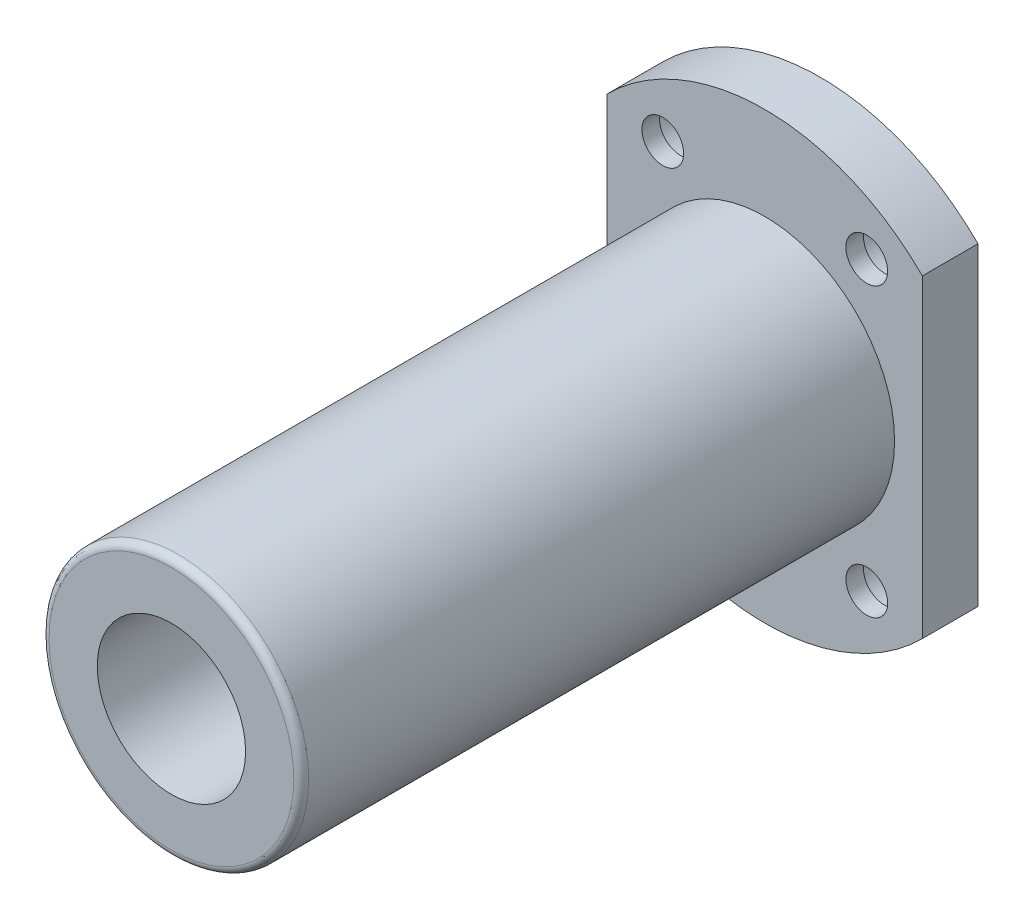
ISO-10303-21;
HEADER;
FILE_DESCRIPTION(('STEP AP214'),'2;1');
FILE_NAME('part.step','',(''),(''),'','','');
FILE_SCHEMA(('AUTOMOTIVE_DESIGN { 1 0 10303 214 1 1 1 1 }'));
ENDSEC;
DATA;
#1=APPLICATION_CONTEXT('core data for automotive mechanical design processes');
#2=APPLICATION_PROTOCOL_DEFINITION('international standard','automotive_design',2000,#1);
#3=PRODUCT_CONTEXT('',#1,'mechanical');
#4=PRODUCT('Part','Part','',(#3));
#5=PRODUCT_RELATED_PRODUCT_CATEGORY('part','',(#4));
#6=PRODUCT_DEFINITION_FORMATION('','',#4);
#7=PRODUCT_DEFINITION_CONTEXT('part definition',#1,'design');
#8=PRODUCT_DEFINITION('design','',#6,#7);
#9=PRODUCT_DEFINITION_SHAPE('','',#8);
#10=(LENGTH_UNIT() NAMED_UNIT(*) SI_UNIT(.MILLI.,.METRE.));
#11=(NAMED_UNIT(*) PLANE_ANGLE_UNIT() SI_UNIT($,.RADIAN.));
#12=(NAMED_UNIT(*) SI_UNIT($,.STERADIAN.) SOLID_ANGLE_UNIT());
#13=UNCERTAINTY_MEASURE_WITH_UNIT(LENGTH_MEASURE(1.E-05),#10,'distance_accuracy_value','');
#14=(GEOMETRIC_REPRESENTATION_CONTEXT(3) GLOBAL_UNCERTAINTY_ASSIGNED_CONTEXT((#13)) GLOBAL_UNIT_ASSIGNED_CONTEXT((#10,
#11,#12)) REPRESENTATION_CONTEXT('',''));
#15=CARTESIAN_POINT('',(0.,0.,0.));
#16=DIRECTION('',(0.,0.,1.));
#17=DIRECTION('',(1.,0.,0.));
#18=AXIS2_PLACEMENT_3D('',#15,#16,#17);
#19=CARTESIAN_POINT('',(11.,15.5,0.));
#20=DIRECTION('',(0.,0.,1.));
#21=DIRECTION('',(1.,0.,0.));
#22=AXIS2_PLACEMENT_3D('',#19,#20,#21);
#23=CYLINDRICAL_SURFACE('',#22,3.75);
#24=CARTESIAN_POINT('',(11.,15.5,4.1));
#25=DIRECTION('',(0.,0.,1.));
#26=DIRECTION('',(1.,0.,0.));
#27=AXIS2_PLACEMENT_3D('',#24,#25,#26);
#28=CIRCLE('',#27,3.75);
#29=CARTESIAN_POINT('',(14.75,15.5,4.1));
#30=VERTEX_POINT('',#29);
#31=EDGE_CURVE('E19',#30,#30,#28,.F.);
#32=ORIENTED_EDGE('',*,*,#31,.F.);
#33=EDGE_LOOP('',(#32));
#34=FACE_BOUND('',#33,.T.);
#35=CARTESIAN_POINT('',(11.,15.5,0.));
#36=DIRECTION('',(0.,0.,1.));
#37=DIRECTION('',(1.,0.,0.));
#38=AXIS2_PLACEMENT_3D('',#35,#36,#37);
#39=CIRCLE('',#38,3.75);
#40=CARTESIAN_POINT('',(14.75,15.5,0.));
#41=VERTEX_POINT('',#40);
#42=EDGE_CURVE('E204',#41,#41,#39,.T.);
#43=ORIENTED_EDGE('',*,*,#42,.F.);
#44=EDGE_LOOP('',(#43));
#45=FACE_BOUND('',#44,.T.);
#46=ADVANCED_FACE('F16',(#34,#45),#23,.F.);
#47=CARTESIAN_POINT('',(-11.,15.5,0.));
#48=DIRECTION('',(0.,0.,1.));
#49=DIRECTION('',(1.,0.,0.));
#50=AXIS2_PLACEMENT_3D('',#47,#48,#49);
#51=CYLINDRICAL_SURFACE('',#50,3.75);
#52=CARTESIAN_POINT('',(-11.,15.5,4.1));
#53=DIRECTION('',(0.,0.,1.));
#54=DIRECTION('',(1.,0.,0.));
#55=AXIS2_PLACEMENT_3D('',#52,#53,#54);
#56=CIRCLE('',#55,3.75);
#57=CARTESIAN_POINT('',(-7.25,15.5,4.1));
#58=VERTEX_POINT('',#57);
#59=EDGE_CURVE('E206',#58,#58,#56,.F.);
#60=ORIENTED_EDGE('',*,*,#59,.F.);
#61=EDGE_LOOP('',(#60));
#62=FACE_BOUND('',#61,.T.);
#63=CARTESIAN_POINT('',(-11.,15.5,0.));
#64=DIRECTION('',(0.,0.,1.));
#65=DIRECTION('',(1.,0.,0.));
#66=AXIS2_PLACEMENT_3D('',#63,#64,#65);
#67=CIRCLE('',#66,3.75);
#68=CARTESIAN_POINT('',(-7.25,15.5,0.));
#69=VERTEX_POINT('',#68);
#70=EDGE_CURVE('E201',#69,#69,#67,.T.);
#71=ORIENTED_EDGE('',*,*,#70,.F.);
#72=EDGE_LOOP('',(#71));
#73=FACE_BOUND('',#72,.T.);
#74=ADVANCED_FACE('F132',(#62,#73),#51,.F.);
#75=CARTESIAN_POINT('',(-11.,-15.5,6.));
#76=DIRECTION('',(0.,0.,-1.));
#77=DIRECTION('',(-1.,0.,0.));
#78=AXIS2_PLACEMENT_3D('',#75,#76,#77);
#79=CYLINDRICAL_SURFACE('',#78,3.75);
#80=CARTESIAN_POINT('',(-11.,-15.5,0.));
#81=DIRECTION('',(0.,0.,-1.));
#82=DIRECTION('',(-1.,0.,0.));
#83=AXIS2_PLACEMENT_3D('',#80,#81,#82);
#84=CIRCLE('',#83,3.75);
#85=CARTESIAN_POINT('',(-14.75,-15.5,0.));
#86=VERTEX_POINT('',#85);
#87=EDGE_CURVE('E195',#86,#86,#84,.F.);
#88=ORIENTED_EDGE('',*,*,#87,.F.);
#89=EDGE_LOOP('',(#88));
#90=FACE_BOUND('',#89,.T.);
#91=CARTESIAN_POINT('',(-11.,-15.5,4.1));
#92=DIRECTION('',(0.,0.,-1.));
#93=DIRECTION('',(-1.,0.,0.));
#94=AXIS2_PLACEMENT_3D('',#91,#92,#93);
#95=CIRCLE('',#94,3.75);
#96=CARTESIAN_POINT('',(-14.75,-15.5,4.1));
#97=VERTEX_POINT('',#96);
#98=EDGE_CURVE('E189',#97,#97,#95,.T.);
#99=ORIENTED_EDGE('',*,*,#98,.F.);
#100=EDGE_LOOP('',(#99));
#101=FACE_BOUND('',#100,.T.);
#102=ADVANCED_FACE('F129',(#90,#101),#79,.F.);
#103=CARTESIAN_POINT('',(11.,-15.5,6.));
#104=DIRECTION('',(0.,0.,-1.));
#105=DIRECTION('',(-1.,0.,0.));
#106=AXIS2_PLACEMENT_3D('',#103,#104,#105);
#107=CYLINDRICAL_SURFACE('',#106,3.75);
#108=CARTESIAN_POINT('',(11.,-15.5,0.));
#109=DIRECTION('',(0.,0.,-1.));
#110=DIRECTION('',(-1.,0.,0.));
#111=AXIS2_PLACEMENT_3D('',#108,#109,#110);
#112=CIRCLE('',#111,3.75);
#113=CARTESIAN_POINT('',(7.25,-15.5,0.));
#114=VERTEX_POINT('',#113);
#115=EDGE_CURVE('E192',#114,#114,#112,.F.);
#116=ORIENTED_EDGE('',*,*,#115,.F.);
#117=EDGE_LOOP('',(#116));
#118=FACE_BOUND('',#117,.T.);
#119=CARTESIAN_POINT('',(11.,-15.5,4.1));
#120=DIRECTION('',(0.,0.,-1.));
#121=DIRECTION('',(-1.,0.,0.));
#122=AXIS2_PLACEMENT_3D('',#119,#120,#121);
#123=CIRCLE('',#122,3.75);
#124=CARTESIAN_POINT('',(7.25,-15.5,4.1));
#125=VERTEX_POINT('',#124);
#126=EDGE_CURVE('E186',#125,#125,#123,.T.);
#127=ORIENTED_EDGE('',*,*,#126,.F.);
#128=EDGE_LOOP('',(#127));
#129=FACE_BOUND('',#128,.T.);
#130=ADVANCED_FACE('F125',(#118,#129),#107,.F.);
#131=CARTESIAN_POINT('',(0.,0.,0.));
#132=DIRECTION('',(0.,0.,1.));
#133=DIRECTION('',(1.,0.,0.));
#134=AXIS2_PLACEMENT_3D('',#131,#132,#133);
#135=CYLINDRICAL_SURFACE('',#134,8.);
#136=CARTESIAN_POINT('',(0.,0.,70.));
#137=DIRECTION('',(0.,0.,1.));
#138=DIRECTION('',(1.,0.,0.));
#139=AXIS2_PLACEMENT_3D('',#136,#137,#138);
#140=CIRCLE('',#139,8.);
#141=CARTESIAN_POINT('',(8.,0.,70.));
#142=VERTEX_POINT('',#141);
#143=EDGE_CURVE('E183',#142,#142,#140,.F.);
#144=ORIENTED_EDGE('',*,*,#143,.F.);
#145=EDGE_LOOP('',(#144));
#146=FACE_BOUND('',#145,.T.);
#147=CARTESIAN_POINT('',(0.,0.,0.));
#148=DIRECTION('',(0.,0.,1.));
#149=DIRECTION('',(1.,0.,0.));
#150=AXIS2_PLACEMENT_3D('',#147,#148,#149);
#151=CIRCLE('',#150,8.);
#152=CARTESIAN_POINT('',(8.,0.,0.));
#153=VERTEX_POINT('',#152);
#154=EDGE_CURVE('E198',#153,#153,#151,.T.);
#155=ORIENTED_EDGE('',*,*,#154,.F.);
#156=EDGE_LOOP('',(#155));
#157=FACE_BOUND('',#156,.T.);
#158=ADVANCED_FACE('F121',(#146,#157),#135,.F.);
#159=CARTESIAN_POINT('',(11.,17.75,4.1));
#160=DIRECTION('',(0.,0.,-1.));
#161=DIRECTION('',(-1.,0.,0.));
#162=AXIS2_PLACEMENT_3D('',#159,#160,#161);
#163=PLANE('',#162);
#164=CARTESIAN_POINT('',(11.,15.5,4.1));
#165=DIRECTION('',(0.,0.,1.));
#166=DIRECTION('',(1.,0.,0.));
#167=AXIS2_PLACEMENT_3D('',#164,#165,#166);
#168=CIRCLE('',#167,2.25);
#169=CARTESIAN_POINT('',(13.25,15.5,4.1));
#170=VERTEX_POINT('',#169);
#171=EDGE_CURVE('E180',#170,#170,#168,.T.);
#172=ORIENTED_EDGE('',*,*,#171,.T.);
#173=EDGE_LOOP('',(#172));
#174=FACE_BOUND('',#173,.T.);
#175=ORIENTED_EDGE('',*,*,#31,.T.);
#176=EDGE_LOOP('',(#175));
#177=FACE_BOUND('',#176,.T.);
#178=ADVANCED_FACE('F117',(#174,#177),#163,.T.);
#179=CARTESIAN_POINT('',(-11.,17.75,4.1));
#180=DIRECTION('',(0.,0.,-1.));
#181=DIRECTION('',(-1.,0.,0.));
#182=AXIS2_PLACEMENT_3D('',#179,#180,#181);
#183=PLANE('',#182);
#184=CARTESIAN_POINT('',(-11.,15.5,4.1));
#185=DIRECTION('',(0.,0.,1.));
#186=DIRECTION('',(1.,0.,0.));
#187=AXIS2_PLACEMENT_3D('',#184,#185,#186);
#188=CIRCLE('',#187,2.25);
#189=CARTESIAN_POINT('',(-8.75,15.5,4.1));
#190=VERTEX_POINT('',#189);
#191=EDGE_CURVE('E177',#190,#190,#188,.T.);
#192=ORIENTED_EDGE('',*,*,#191,.T.);
#193=EDGE_LOOP('',(#192));
#194=FACE_BOUND('',#193,.T.);
#195=ORIENTED_EDGE('',*,*,#59,.T.);
#196=EDGE_LOOP('',(#195));
#197=FACE_BOUND('',#196,.T.);
#198=ADVANCED_FACE('F113',(#194,#197),#183,.T.);
#199=CARTESIAN_POINT('',(0.,8.,0.));
#200=DIRECTION('',(0.,0.,-1.));
#201=DIRECTION('',(-1.,0.,0.));
#202=AXIS2_PLACEMENT_3D('',#199,#200,#201);
#203=PLANE('',#202);
#204=ORIENTED_EDGE('',*,*,#115,.T.);
#205=EDGE_LOOP('',(#204));
#206=FACE_BOUND('',#205,.T.);
#207=ORIENTED_EDGE('',*,*,#87,.T.);
#208=EDGE_LOOP('',(#207));
#209=FACE_BOUND('',#208,.T.);
#210=DIRECTION('',(0.,1.,0.));
#211=VECTOR('',#210,1.);
#212=CARTESIAN_POINT('',(17.,-16.9410743460974,0.));
#213=LINE('',#212,#211);
#214=CARTESIAN_POINT('',(17.,16.9410743460974,0.));
#215=VERTEX_POINT('',#214);
#216=CARTESIAN_POINT('',(17.,-16.9410743460974,0.));
#217=VERTEX_POINT('',#216);
#218=EDGE_CURVE('E66',#215,#217,#213,.F.);
#219=ORIENTED_EDGE('',*,*,#218,.T.);
#220=CARTESIAN_POINT('',(0.,0.,0.));
#221=DIRECTION('',(0.,0.,1.));
#222=DIRECTION('',(1.,0.,0.));
#223=AXIS2_PLACEMENT_3D('',#220,#221,#222);
#224=CIRCLE('',#223,24.);
#225=CARTESIAN_POINT('',(-17.,-16.9410743460974,0.));
#226=VERTEX_POINT('',#225);
#227=EDGE_CURVE('E55',#226,#217,#224,.T.);
#228=ORIENTED_EDGE('',*,*,#227,.F.);
#229=DIRECTION('',(0.,1.,0.));
#230=VECTOR('',#229,1.);
#231=CARTESIAN_POINT('',(-17.,16.9410743460974,0.));
#232=LINE('',#231,#230);
#233=CARTESIAN_POINT('',(-17.,16.9410743460974,0.));
#234=VERTEX_POINT('',#233);
#235=EDGE_CURVE('E64',#226,#234,#232,.T.);
#236=ORIENTED_EDGE('',*,*,#235,.T.);
#237=CARTESIAN_POINT('',(0.,0.,0.));
#238=DIRECTION('',(0.,0.,1.));
#239=DIRECTION('',(1.,0.,0.));
#240=AXIS2_PLACEMENT_3D('',#237,#238,#239);
#241=CIRCLE('',#240,24.);
#242=EDGE_CURVE('E70',#215,#234,#241,.T.);
#243=ORIENTED_EDGE('',*,*,#242,.F.);
#244=EDGE_LOOP('',(#219,#228,#236,#243));
#245=FACE_BOUND('',#244,.T.);
#246=ORIENTED_EDGE('',*,*,#154,.T.);
#247=EDGE_LOOP('',(#246));
#248=FACE_BOUND('',#247,.T.);
#249=ORIENTED_EDGE('',*,*,#70,.T.);
#250=EDGE_LOOP('',(#249));
#251=FACE_BOUND('',#250,.T.);
#252=ORIENTED_EDGE('',*,*,#42,.T.);
#253=EDGE_LOOP('',(#252));
#254=FACE_BOUND('',#253,.T.);
#255=ADVANCED_FACE('F67',(#206,#209,#245,#248,#251,#254),#203,.T.);
#256=CARTESIAN_POINT('',(-11.,-19.25,4.1));
#257=DIRECTION('',(0.,0.,-1.));
#258=DIRECTION('',(-1.,0.,0.));
#259=AXIS2_PLACEMENT_3D('',#256,#257,#258);
#260=PLANE('',#259);
#261=ORIENTED_EDGE('',*,*,#98,.T.);
#262=EDGE_LOOP('',(#261));
#263=FACE_BOUND('',#262,.T.);
#264=CARTESIAN_POINT('',(-11.,-15.5,4.1));
#265=DIRECTION('',(0.,0.,-1.));
#266=DIRECTION('',(-1.,0.,0.));
#267=AXIS2_PLACEMENT_3D('',#264,#265,#266);
#268=CIRCLE('',#267,2.25);
#269=CARTESIAN_POINT('',(-13.25,-15.5,4.1));
#270=VERTEX_POINT('',#269);
#271=EDGE_CURVE('E172',#270,#270,#268,.F.);
#272=ORIENTED_EDGE('',*,*,#271,.T.);
#273=EDGE_LOOP('',(#272));
#274=FACE_BOUND('',#273,.T.);
#275=ADVANCED_FACE('F106',(#263,#274),#260,.T.);
#276=CARTESIAN_POINT('',(11.,-19.25,4.1));
#277=DIRECTION('',(0.,0.,-1.));
#278=DIRECTION('',(-1.,0.,0.));
#279=AXIS2_PLACEMENT_3D('',#276,#277,#278);
#280=PLANE('',#279);
#281=ORIENTED_EDGE('',*,*,#126,.T.);
#282=EDGE_LOOP('',(#281));
#283=FACE_BOUND('',#282,.T.);
#284=CARTESIAN_POINT('',(11.,-15.5,4.1));
#285=DIRECTION('',(0.,0.,-1.));
#286=DIRECTION('',(-1.,0.,0.));
#287=AXIS2_PLACEMENT_3D('',#284,#285,#286);
#288=CIRCLE('',#287,2.25);
#289=CARTESIAN_POINT('',(8.75,-15.5,4.1));
#290=VERTEX_POINT('',#289);
#291=EDGE_CURVE('E227',#290,#290,#288,.F.);
#292=ORIENTED_EDGE('',*,*,#291,.T.);
#293=EDGE_LOOP('',(#292));
#294=FACE_BOUND('',#293,.T.);
#295=ADVANCED_FACE('F102',(#283,#294),#280,.T.);
#296=CARTESIAN_POINT('',(0.,13.2,70.));
#297=DIRECTION('',(0.,0.,1.));
#298=DIRECTION('',(1.,0.,0.));
#299=AXIS2_PLACEMENT_3D('',#296,#297,#298);
#300=PLANE('',#299);
#301=CARTESIAN_POINT('',(0.,0.,70.));
#302=DIRECTION('',(0.,0.,-1.));
#303=DIRECTION('',(-1.,0.,0.));
#304=AXIS2_PLACEMENT_3D('',#301,#302,#303);
#305=CIRCLE('',#304,13.2);
#306=CARTESIAN_POINT('',(-13.2,0.,70.));
#307=VERTEX_POINT('',#306);
#308=EDGE_CURVE('E85',#307,#307,#305,.T.);
#309=ORIENTED_EDGE('',*,*,#308,.F.);
#310=EDGE_LOOP('',(#309));
#311=FACE_BOUND('',#310,.T.);
#312=ORIENTED_EDGE('',*,*,#143,.T.);
#313=EDGE_LOOP('',(#312));
#314=FACE_BOUND('',#313,.T.);
#315=ADVANCED_FACE('F91',(#311,#314),#300,.T.);
#316=CARTESIAN_POINT('',(11.,15.5,0.));
#317=DIRECTION('',(0.,0.,1.));
#318=DIRECTION('',(1.,0.,0.));
#319=AXIS2_PLACEMENT_3D('',#316,#317,#318);
#320=CYLINDRICAL_SURFACE('',#319,2.25);
#321=CARTESIAN_POINT('',(11.,15.5,6.));
#322=DIRECTION('',(0.,0.,1.));
#323=DIRECTION('',(1.,0.,0.));
#324=AXIS2_PLACEMENT_3D('',#321,#322,#323);
#325=CIRCLE('',#324,2.25);
#326=CARTESIAN_POINT('',(13.25,15.5,6.));
#327=VERTEX_POINT('',#326);
#328=EDGE_CURVE('E231',#327,#327,#325,.F.);
#329=ORIENTED_EDGE('',*,*,#328,.F.);
#330=EDGE_LOOP('',(#329));
#331=FACE_BOUND('',#330,.T.);
#332=ORIENTED_EDGE('',*,*,#171,.F.);
#333=EDGE_LOOP('',(#332));
#334=FACE_BOUND('',#333,.T.);
#335=ADVANCED_FACE('F101',(#331,#334),#320,.F.);
#336=CARTESIAN_POINT('',(-11.,15.5,0.));
#337=DIRECTION('',(0.,0.,1.));
#338=DIRECTION('',(1.,0.,0.));
#339=AXIS2_PLACEMENT_3D('',#336,#337,#338);
#340=CYLINDRICAL_SURFACE('',#339,2.25);
#341=CARTESIAN_POINT('',(-11.,15.5,6.));
#342=DIRECTION('',(0.,0.,1.));
#343=DIRECTION('',(1.,0.,0.));
#344=AXIS2_PLACEMENT_3D('',#341,#342,#343);
#345=CIRCLE('',#344,2.25);
#346=CARTESIAN_POINT('',(-8.75,15.5,6.));
#347=VERTEX_POINT('',#346);
#348=EDGE_CURVE('E235',#347,#347,#345,.F.);
#349=ORIENTED_EDGE('',*,*,#348,.F.);
#350=EDGE_LOOP('',(#349));
#351=FACE_BOUND('',#350,.T.);
#352=ORIENTED_EDGE('',*,*,#191,.F.);
#353=EDGE_LOOP('',(#352));
#354=FACE_BOUND('',#353,.T.);
#355=ADVANCED_FACE('F273',(#351,#354),#340,.F.);
#356=CARTESIAN_POINT('',(-17.,16.9410743460974,6.));
#357=DIRECTION('',(1.,0.,0.));
#358=DIRECTION('',(0.,0.,-1.));
#359=AXIS2_PLACEMENT_3D('',#356,#357,#358);
#360=PLANE('',#359);
#361=DIRECTION('',(0.,0.,1.));
#362=VECTOR('',#361,1.);
#363=CARTESIAN_POINT('',(-17.,-16.9410743460974,6.));
#364=LINE('',#363,#362);
#365=CARTESIAN_POINT('',(-17.,-16.9410743460974,6.));
#366=VERTEX_POINT('',#365);
#367=EDGE_CURVE('E63',#366,#226,#364,.F.);
#368=ORIENTED_EDGE('',*,*,#367,.F.);
#369=DIRECTION('',(0.,1.,0.));
#370=VECTOR('',#369,1.);
#371=CARTESIAN_POINT('',(-17.,0.,6.));
#372=LINE('',#371,#370);
#373=CARTESIAN_POINT('',(-17.,16.9410743460974,6.));
#374=VERTEX_POINT('',#373);
#375=EDGE_CURVE('E165',#374,#366,#372,.F.);
#376=ORIENTED_EDGE('',*,*,#375,.F.);
#377=DIRECTION('',(0.,0.,1.));
#378=VECTOR('',#377,1.);
#379=CARTESIAN_POINT('',(-17.,16.9410743460974,6.));
#380=LINE('',#379,#378);
#381=EDGE_CURVE('E167',#234,#374,#380,.T.);
#382=ORIENTED_EDGE('',*,*,#381,.F.);
#383=ORIENTED_EDGE('',*,*,#235,.F.);
#384=EDGE_LOOP('',(#368,#376,#382,#383));
#385=FACE_BOUND('',#384,.T.);
#386=ADVANCED_FACE('F256',(#385),#360,.F.);
#387=CARTESIAN_POINT('',(0.,0.,6.));
#388=DIRECTION('',(0.,0.,1.));
#389=DIRECTION('',(1.,0.,0.));
#390=AXIS2_PLACEMENT_3D('',#387,#388,#389);
#391=CYLINDRICAL_SURFACE('',#390,24.);
#392=CARTESIAN_POINT('',(0.,0.,6.));
#393=DIRECTION('',(0.,0.,1.));
#394=DIRECTION('',(1.,0.,0.));
#395=AXIS2_PLACEMENT_3D('',#392,#393,#394);
#396=CIRCLE('',#395,24.);
#397=CARTESIAN_POINT('',(17.,-16.9410743460974,6.));
#398=VERTEX_POINT('',#397);
#399=EDGE_CURVE('E238',#366,#398,#396,.T.);
#400=ORIENTED_EDGE('',*,*,#399,.F.);
#401=ORIENTED_EDGE('',*,*,#367,.T.);
#402=ORIENTED_EDGE('',*,*,#227,.T.);
#403=DIRECTION('',(0.,0.,1.));
#404=VECTOR('',#403,1.);
#405=CARTESIAN_POINT('',(17.,-16.9410743460974,6.));
#406=LINE('',#405,#404);
#407=EDGE_CURVE('E62',#217,#398,#406,.T.);
#408=ORIENTED_EDGE('',*,*,#407,.T.);
#409=EDGE_LOOP('',(#400,#401,#402,#408));
#410=FACE_BOUND('',#409,.T.);
#411=ADVANCED_FACE('F60',(#410),#391,.T.);
#412=CARTESIAN_POINT('',(17.,-16.9410743460974,6.));
#413=DIRECTION('',(-1.,0.,0.));
#414=DIRECTION('',(0.,0.,1.));
#415=AXIS2_PLACEMENT_3D('',#412,#413,#414);
#416=PLANE('',#415);
#417=DIRECTION('',(0.,0.,1.));
#418=VECTOR('',#417,1.);
#419=CARTESIAN_POINT('',(17.,16.9410743460974,6.));
#420=LINE('',#419,#418);
#421=CARTESIAN_POINT('',(17.,16.9410743460974,6.));
#422=VERTEX_POINT('',#421);
#423=EDGE_CURVE('E34',#422,#215,#420,.F.);
#424=ORIENTED_EDGE('',*,*,#423,.F.);
#425=DIRECTION('',(0.,1.,0.));
#426=VECTOR('',#425,1.);
#427=CARTESIAN_POINT('',(17.,0.,6.));
#428=LINE('',#427,#426);
#429=EDGE_CURVE('E74',#398,#422,#428,.T.);
#430=ORIENTED_EDGE('',*,*,#429,.F.);
#431=ORIENTED_EDGE('',*,*,#407,.F.);
#432=ORIENTED_EDGE('',*,*,#218,.F.);
#433=EDGE_LOOP('',(#424,#430,#431,#432));
#434=FACE_BOUND('',#433,.T.);
#435=ADVANCED_FACE('F72',(#434),#416,.F.);
#436=CARTESIAN_POINT('',(0.,0.,6.));
#437=DIRECTION('',(0.,0.,1.));
#438=DIRECTION('',(1.,0.,0.));
#439=AXIS2_PLACEMENT_3D('',#436,#437,#438);
#440=CYLINDRICAL_SURFACE('',#439,24.);
#441=CARTESIAN_POINT('',(0.,0.,6.));
#442=DIRECTION('',(0.,0.,1.));
#443=DIRECTION('',(1.,0.,0.));
#444=AXIS2_PLACEMENT_3D('',#441,#442,#443);
#445=CIRCLE('',#444,24.);
#446=EDGE_CURVE('E240',#422,#374,#445,.T.);
#447=ORIENTED_EDGE('',*,*,#446,.F.);
#448=ORIENTED_EDGE('',*,*,#423,.T.);
#449=ORIENTED_EDGE('',*,*,#242,.T.);
#450=ORIENTED_EDGE('',*,*,#381,.T.);
#451=EDGE_LOOP('',(#447,#448,#449,#450));
#452=FACE_BOUND('',#451,.T.);
#453=ADVANCED_FACE('F260',(#452),#440,.T.);
#454=CARTESIAN_POINT('',(-11.,-15.5,6.));
#455=DIRECTION('',(0.,0.,-1.));
#456=DIRECTION('',(-1.,0.,0.));
#457=AXIS2_PLACEMENT_3D('',#454,#455,#456);
#458=CYLINDRICAL_SURFACE('',#457,2.25);
#459=ORIENTED_EDGE('',*,*,#271,.F.);
#460=EDGE_LOOP('',(#459));
#461=FACE_BOUND('',#460,.T.);
#462=CARTESIAN_POINT('',(-11.,-15.5,6.));
#463=DIRECTION('',(0.,0.,-1.));
#464=DIRECTION('',(-1.,0.,0.));
#465=AXIS2_PLACEMENT_3D('',#462,#463,#464);
#466=CIRCLE('',#465,2.25);
#467=CARTESIAN_POINT('',(-13.25,-15.5,6.));
#468=VERTEX_POINT('',#467);
#469=EDGE_CURVE('E242',#468,#468,#466,.T.);
#470=ORIENTED_EDGE('',*,*,#469,.F.);
#471=EDGE_LOOP('',(#470));
#472=FACE_BOUND('',#471,.T.);
#473=ADVANCED_FACE('F262',(#461,#472),#458,.F.);
#474=CARTESIAN_POINT('',(11.,-15.5,6.));
#475=DIRECTION('',(0.,0.,-1.));
#476=DIRECTION('',(-1.,0.,0.));
#477=AXIS2_PLACEMENT_3D('',#474,#475,#476);
#478=CYLINDRICAL_SURFACE('',#477,2.25);
#479=ORIENTED_EDGE('',*,*,#291,.F.);
#480=EDGE_LOOP('',(#479));
#481=FACE_BOUND('',#480,.T.);
#482=CARTESIAN_POINT('',(11.,-15.5,6.));
#483=DIRECTION('',(0.,0.,-1.));
#484=DIRECTION('',(-1.,0.,0.));
#485=AXIS2_PLACEMENT_3D('',#482,#483,#484);
#486=CIRCLE('',#485,2.25);
#487=CARTESIAN_POINT('',(8.75,-15.5,6.));
#488=VERTEX_POINT('',#487);
#489=EDGE_CURVE('E245',#488,#488,#486,.T.);
#490=ORIENTED_EDGE('',*,*,#489,.F.);
#491=EDGE_LOOP('',(#490));
#492=FACE_BOUND('',#491,.T.);
#493=ADVANCED_FACE('F160',(#481,#492),#478,.F.);
#494=CARTESIAN_POINT('',(0.,0.,69.2));
#495=DIRECTION('',(0.,0.,-1.));
#496=DIRECTION('',(-1.,0.,0.));
#497=AXIS2_PLACEMENT_3D('',#494,#495,#496);
#498=TOROIDAL_SURFACE('',#497,13.2,0.800000000000002);
#499=CARTESIAN_POINT('',(0.,0.,69.2));
#500=DIRECTION('',(0.,0.,1.));
#501=DIRECTION('',(1.,0.,0.));
#502=AXIS2_PLACEMENT_3D('',#499,#500,#501);
#503=CIRCLE('',#502,14.);
#504=CARTESIAN_POINT('',(14.,0.,69.2));
#505=VERTEX_POINT('',#504);
#506=EDGE_CURVE('E25',#505,#505,#503,.F.);
#507=ORIENTED_EDGE('',*,*,#506,.F.);
#508=EDGE_LOOP('',(#507));
#509=FACE_BOUND('',#508,.T.);
#510=ORIENTED_EDGE('',*,*,#308,.T.);
#511=EDGE_LOOP('',(#510));
#512=FACE_BOUND('',#511,.T.);
#513=ADVANCED_FACE('F151',(#509,#512),#498,.T.);
#514=CARTESIAN_POINT('',(0.,0.,6.));
#515=DIRECTION('',(0.,0.,1.));
#516=DIRECTION('',(1.,0.,0.));
#517=AXIS2_PLACEMENT_3D('',#514,#515,#516);
#518=PLANE('',#517);
#519=ORIENTED_EDGE('',*,*,#489,.T.);
#520=EDGE_LOOP('',(#519));
#521=FACE_BOUND('',#520,.T.);
#522=ORIENTED_EDGE('',*,*,#469,.T.);
#523=EDGE_LOOP('',(#522));
#524=FACE_BOUND('',#523,.T.);
#525=ORIENTED_EDGE('',*,*,#429,.T.);
#526=ORIENTED_EDGE('',*,*,#446,.T.);
#527=ORIENTED_EDGE('',*,*,#375,.T.);
#528=ORIENTED_EDGE('',*,*,#399,.T.);
#529=EDGE_LOOP('',(#525,#526,#527,#528));
#530=FACE_BOUND('',#529,.T.);
#531=CARTESIAN_POINT('',(0.,0.,6.));
#532=DIRECTION('',(0.,0.,1.));
#533=DIRECTION('',(1.,0.,0.));
#534=AXIS2_PLACEMENT_3D('',#531,#532,#533);
#535=CIRCLE('',#534,14.);
#536=CARTESIAN_POINT('',(14.,0.,6.));
#537=VERTEX_POINT('',#536);
#538=EDGE_CURVE('E10',#537,#537,#535,.T.);
#539=ORIENTED_EDGE('',*,*,#538,.F.);
#540=EDGE_LOOP('',(#539));
#541=FACE_BOUND('',#540,.T.);
#542=ORIENTED_EDGE('',*,*,#348,.T.);
#543=EDGE_LOOP('',(#542));
#544=FACE_BOUND('',#543,.T.);
#545=ORIENTED_EDGE('',*,*,#328,.T.);
#546=EDGE_LOOP('',(#545));
#547=FACE_BOUND('',#546,.T.);
#548=ADVANCED_FACE('F145',(#521,#524,#530,#541,#544,#547),#518,.T.);
#549=CARTESIAN_POINT('',(0.,0.,0.));
#550=DIRECTION('',(0.,0.,1.));
#551=DIRECTION('',(1.,0.,0.));
#552=AXIS2_PLACEMENT_3D('',#549,#550,#551);
#553=CYLINDRICAL_SURFACE('',#552,14.);
#554=ORIENTED_EDGE('',*,*,#538,.T.);
#555=EDGE_LOOP('',(#554));
#556=FACE_BOUND('',#555,.T.);
#557=ORIENTED_EDGE('',*,*,#506,.T.);
#558=EDGE_LOOP('',(#557));
#559=FACE_BOUND('',#558,.T.);
#560=ADVANCED_FACE('F143',(#556,#559),#553,.T.);
#561=CLOSED_SHELL('',(#46,#74,#102,#130,#158,#178,#198,#255,#275,#295,#315,#335,#355,#386,#411,
#435,#453,#473,#493,#513,#548,#560));
#562=MANIFOLD_SOLID_BREP('B1',#561);
#563=ADVANCED_BREP_SHAPE_REPRESENTATION('',(#18,#562),#14);
#564=SHAPE_DEFINITION_REPRESENTATION(#9,#563);
ENDSEC;
END-ISO-10303-21;
